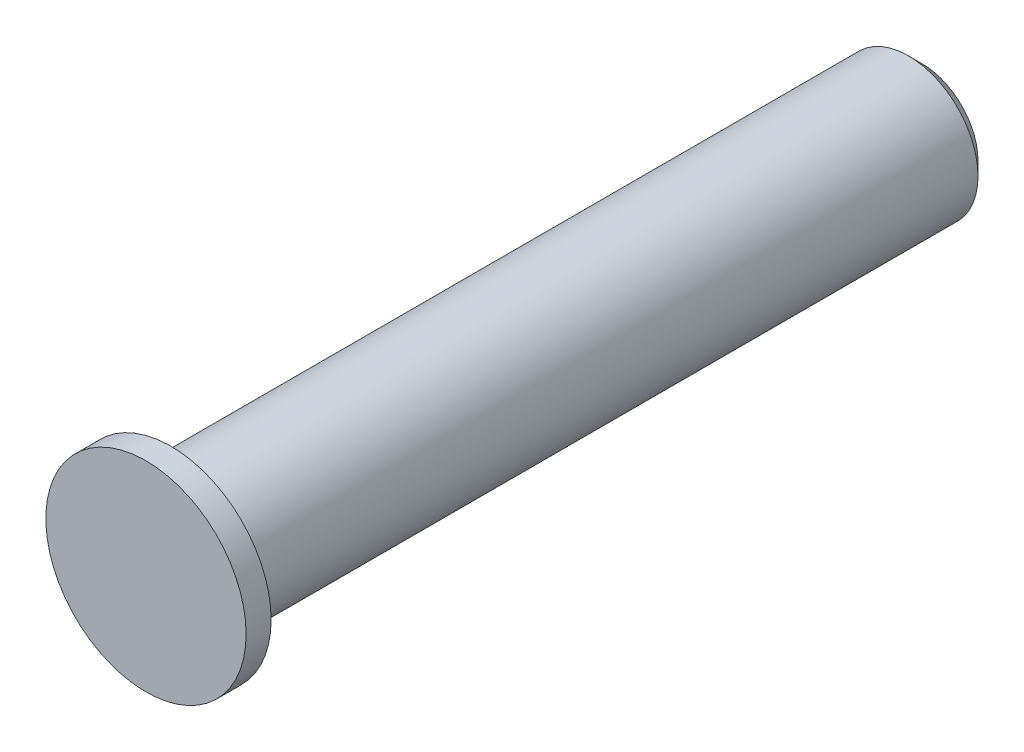
ISO-10303-21;
HEADER;
FILE_DESCRIPTION(('STEP AP214'),'2;1');
FILE_NAME('part.step','',(''),(''),'','','');
FILE_SCHEMA(('AUTOMOTIVE_DESIGN { 1 0 10303 214 1 1 1 1 }'));
ENDSEC;
DATA;
#1=APPLICATION_CONTEXT('core data for automotive mechanical design processes');
#2=APPLICATION_PROTOCOL_DEFINITION('international standard','automotive_design',2000,#1);
#3=PRODUCT_CONTEXT('',#1,'mechanical');
#4=PRODUCT('Part','Part','',(#3));
#5=PRODUCT_RELATED_PRODUCT_CATEGORY('part','',(#4));
#6=PRODUCT_DEFINITION_FORMATION('','',#4);
#7=PRODUCT_DEFINITION_CONTEXT('part definition',#1,'design');
#8=PRODUCT_DEFINITION('design','',#6,#7);
#9=PRODUCT_DEFINITION_SHAPE('','',#8);
#10=(LENGTH_UNIT() NAMED_UNIT(*) SI_UNIT(.MILLI.,.METRE.));
#11=(NAMED_UNIT(*) PLANE_ANGLE_UNIT() SI_UNIT($,.RADIAN.));
#12=(NAMED_UNIT(*) SI_UNIT($,.STERADIAN.) SOLID_ANGLE_UNIT());
#13=UNCERTAINTY_MEASURE_WITH_UNIT(LENGTH_MEASURE(1.E-05),#10,'distance_accuracy_value','');
#14=(GEOMETRIC_REPRESENTATION_CONTEXT(3) GLOBAL_UNCERTAINTY_ASSIGNED_CONTEXT((#13)) GLOBAL_UNIT_ASSIGNED_CONTEXT((#10,
#11,#12)) REPRESENTATION_CONTEXT('',''));
#15=CARTESIAN_POINT('',(0.,0.,0.));
#16=DIRECTION('',(0.,0.,1.));
#17=DIRECTION('',(1.,0.,0.));
#18=AXIS2_PLACEMENT_3D('',#15,#16,#17);
#19=CARTESIAN_POINT('',(-5.,28.,62.));
#20=DIRECTION('',(0.,0.,-1.));
#21=DIRECTION('',(-1.,0.,0.));
#22=AXIS2_PLACEMENT_3D('',#19,#20,#21);
#23=CYLINDRICAL_SURFACE('',#22,8.);
#24=CARTESIAN_POINT('',(-5.,28.,62.));
#25=DIRECTION('',(0.,0.,1.));
#26=DIRECTION('',(1.,0.,0.));
#27=AXIS2_PLACEMENT_3D('',#24,#25,#26);
#28=CIRCLE('',#27,8.);
#29=CARTESIAN_POINT('',(3.,28.,62.));
#30=VERTEX_POINT('',#29);
#31=EDGE_CURVE('E10',#30,#30,#28,.T.);
#32=ORIENTED_EDGE('',*,*,#31,.F.);
#33=EDGE_LOOP('',(#32));
#34=FACE_BOUND('',#33,.T.);
#35=CARTESIAN_POINT('',(-5.,28.,60.));
#36=DIRECTION('',(0.,0.,1.));
#37=DIRECTION('',(1.,0.,0.));
#38=AXIS2_PLACEMENT_3D('',#35,#36,#37);
#39=CIRCLE('',#38,8.);
#40=CARTESIAN_POINT('',(3.,28.,60.));
#41=VERTEX_POINT('',#40);
#42=EDGE_CURVE('E53',#41,#41,#39,.T.);
#43=ORIENTED_EDGE('',*,*,#42,.T.);
#44=EDGE_LOOP('',(#43));
#45=FACE_BOUND('',#44,.T.);
#46=ADVANCED_FACE('F49',(#34,#45),#23,.T.);
#47=CARTESIAN_POINT('',(-5.,28.,62.));
#48=DIRECTION('',(0.,0.,1.));
#49=DIRECTION('',(1.,0.,0.));
#50=AXIS2_PLACEMENT_3D('',#47,#48,#49);
#51=PLANE('',#50);
#52=ORIENTED_EDGE('',*,*,#31,.T.);
#53=EDGE_LOOP('',(#52));
#54=FACE_BOUND('',#53,.T.);
#55=ADVANCED_FACE('F88',(#54),#51,.T.);
#56=CARTESIAN_POINT('',(-5.,28.,60.));
#57=DIRECTION('',(0.,0.,1.));
#58=DIRECTION('',(1.,0.,0.));
#59=AXIS2_PLACEMENT_3D('',#56,#57,#58);
#60=PLANE('',#59);
#61=ORIENTED_EDGE('',*,*,#42,.F.);
#62=EDGE_LOOP('',(#61));
#63=FACE_BOUND('',#62,.T.);
#64=CARTESIAN_POINT('',(-5.,28.,60.));
#65=DIRECTION('',(0.,0.,1.));
#66=DIRECTION('',(1.,0.,0.));
#67=AXIS2_PLACEMENT_3D('',#64,#65,#66);
#68=CIRCLE('',#67,5.55625);
#69=CARTESIAN_POINT('',(0.556249999999999,28.,60.));
#70=VERTEX_POINT('',#69);
#71=EDGE_CURVE('E62',#70,#70,#68,.T.);
#72=ORIENTED_EDGE('',*,*,#71,.T.);
#73=EDGE_LOOP('',(#72));
#74=FACE_BOUND('',#73,.T.);
#75=ADVANCED_FACE('F93',(#63,#74),#60,.F.);
#76=CARTESIAN_POINT('',(-5.,28.,0.));
#77=DIRECTION('',(0.,0.,1.));
#78=DIRECTION('',(1.,0.,0.));
#79=AXIS2_PLACEMENT_3D('',#76,#77,#78);
#80=CYLINDRICAL_SURFACE('',#79,5.55625);
#81=ORIENTED_EDGE('',*,*,#71,.F.);
#82=EDGE_LOOP('',(#81));
#83=FACE_BOUND('',#82,.T.);
#84=CARTESIAN_POINT('',(-5.,28.,1.07949999999998));
#85=DIRECTION('',(0.,0.,1.));
#86=DIRECTION('',(1.,0.,0.));
#87=AXIS2_PLACEMENT_3D('',#84,#85,#86);
#88=CIRCLE('',#87,5.55625);
#89=CARTESIAN_POINT('',(0.55625,28.,1.07949999999998));
#90=VERTEX_POINT('',#89);
#91=EDGE_CURVE('E71',#90,#90,#88,.T.);
#92=ORIENTED_EDGE('',*,*,#91,.T.);
#93=EDGE_LOOP('',(#92));
#94=FACE_BOUND('',#93,.T.);
#95=ADVANCED_FACE('F76',(#83,#94),#80,.T.);
#96=CARTESIAN_POINT('',(-5.,28.,0.));
#97=DIRECTION('',(0.,0.,1.));
#98=DIRECTION('',(1.,0.,0.));
#99=AXIS2_PLACEMENT_3D('',#96,#97,#98);
#100=CONICAL_SURFACE('',#99,4.47675,0.785398163397455);
#101=ORIENTED_EDGE('',*,*,#91,.F.);
#102=EDGE_LOOP('',(#101));
#103=FACE_BOUND('',#102,.T.);
#104=CARTESIAN_POINT('',(-5.,28.,0.));
#105=DIRECTION('',(0.,0.,1.));
#106=DIRECTION('',(1.,0.,0.));
#107=AXIS2_PLACEMENT_3D('',#104,#105,#106);
#108=CIRCLE('',#107,4.47675);
#109=CARTESIAN_POINT('',(-0.523249999999999,28.,0.));
#110=VERTEX_POINT('',#109);
#111=EDGE_CURVE('E67',#110,#110,#108,.T.);
#112=ORIENTED_EDGE('',*,*,#111,.T.);
#113=EDGE_LOOP('',(#112));
#114=FACE_BOUND('',#113,.T.);
#115=ADVANCED_FACE('F78',(#103,#114),#100,.T.);
#116=CARTESIAN_POINT('',(-5.,28.,0.));
#117=DIRECTION('',(0.,0.,1.));
#118=DIRECTION('',(1.,0.,0.));
#119=AXIS2_PLACEMENT_3D('',#116,#117,#118);
#120=PLANE('',#119);
#121=ORIENTED_EDGE('',*,*,#111,.F.);
#122=EDGE_LOOP('',(#121));
#123=FACE_BOUND('',#122,.T.);
#124=ADVANCED_FACE('F51',(#123),#120,.F.);
#125=CLOSED_SHELL('',(#46,#55,#75,#95,#115,#124));
#126=MANIFOLD_SOLID_BREP('B2',#125);
#127=ADVANCED_BREP_SHAPE_REPRESENTATION('',(#18,#126),#14);
#128=SHAPE_DEFINITION_REPRESENTATION(#9,#127);
ENDSEC;
END-ISO-10303-21;
